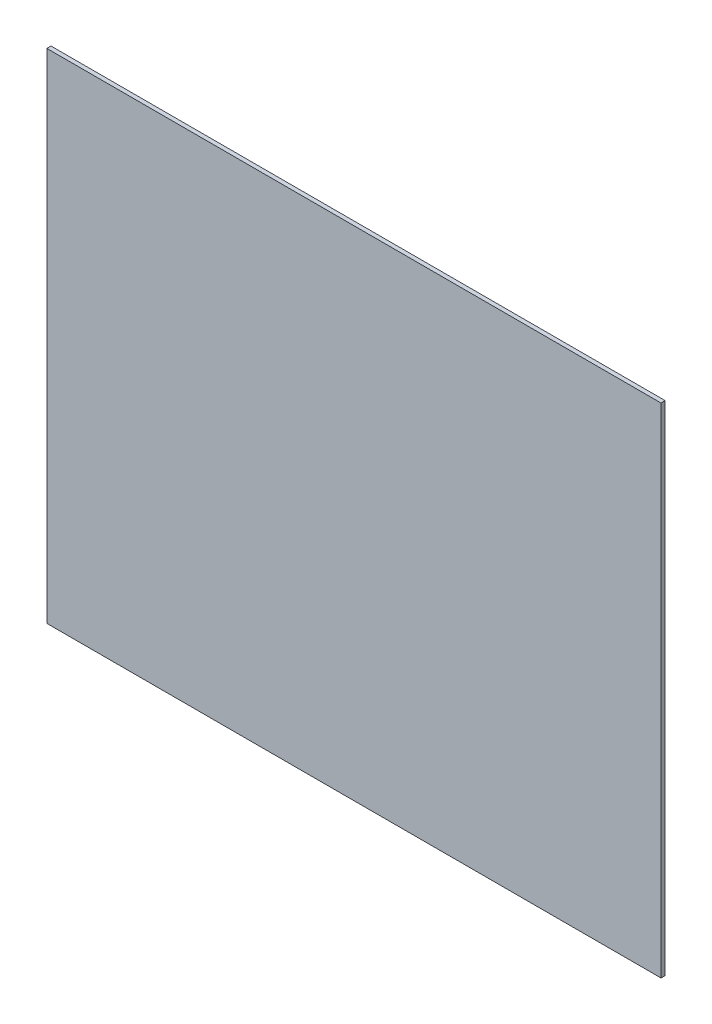
ISO-10303-21;
HEADER;
FILE_DESCRIPTION(('STEP AP214'),'2;1');
FILE_NAME('part.step','',(''),(''),'','','');
FILE_SCHEMA(('AUTOMOTIVE_DESIGN { 1 0 10303 214 1 1 1 1 }'));
ENDSEC;
DATA;
#1=APPLICATION_CONTEXT('core data for automotive mechanical design processes');
#2=APPLICATION_PROTOCOL_DEFINITION('international standard','automotive_design',2000,#1);
#3=PRODUCT_CONTEXT('',#1,'mechanical');
#4=PRODUCT('Part','Part','',(#3));
#5=PRODUCT_RELATED_PRODUCT_CATEGORY('part','',(#4));
#6=PRODUCT_DEFINITION_FORMATION('','',#4);
#7=PRODUCT_DEFINITION_CONTEXT('part definition',#1,'design');
#8=PRODUCT_DEFINITION('design','',#6,#7);
#9=PRODUCT_DEFINITION_SHAPE('','',#8);
#10=(LENGTH_UNIT() NAMED_UNIT(*) SI_UNIT(.MILLI.,.METRE.));
#11=(NAMED_UNIT(*) PLANE_ANGLE_UNIT() SI_UNIT($,.RADIAN.));
#12=(NAMED_UNIT(*) SI_UNIT($,.STERADIAN.) SOLID_ANGLE_UNIT());
#13=UNCERTAINTY_MEASURE_WITH_UNIT(LENGTH_MEASURE(1.E-05),#10,'distance_accuracy_value','');
#14=(GEOMETRIC_REPRESENTATION_CONTEXT(3) GLOBAL_UNCERTAINTY_ASSIGNED_CONTEXT((#13)) GLOBAL_UNIT_ASSIGNED_CONTEXT((#10,
#11,#12)) REPRESENTATION_CONTEXT('',''));
#15=CARTESIAN_POINT('',(0.,0.,0.));
#16=DIRECTION('',(0.,0.,1.));
#17=DIRECTION('',(1.,0.,0.));
#18=AXIS2_PLACEMENT_3D('',#15,#16,#17);
#19=CARTESIAN_POINT('',(234.95,-190.5,3.175));
#20=DIRECTION('',(-1.,0.,0.));
#21=DIRECTION('',(0.,0.,1.));
#22=AXIS2_PLACEMENT_3D('',#19,#20,#21);
#23=PLANE('',#22);
#24=DIRECTION('',(0.,1.,0.));
#25=VECTOR('',#24,1.);
#26=CARTESIAN_POINT('',(234.95,-190.5,0.));
#27=LINE('',#26,#25);
#28=CARTESIAN_POINT('',(234.95,-190.5,0.));
#29=VERTEX_POINT('',#28);
#30=CARTESIAN_POINT('',(234.95,190.5,0.));
#31=VERTEX_POINT('',#30);
#32=EDGE_CURVE('E97',#29,#31,#27,.T.);
#33=ORIENTED_EDGE('',*,*,#32,.T.);
#34=DIRECTION('',(0.,0.,-1.));
#35=VECTOR('',#34,1.);
#36=CARTESIAN_POINT('',(234.95,190.5,3.175));
#37=LINE('',#36,#35);
#38=CARTESIAN_POINT('',(234.95,190.5,3.175));
#39=VERTEX_POINT('',#38);
#40=EDGE_CURVE('E11',#39,#31,#37,.T.);
#41=ORIENTED_EDGE('',*,*,#40,.F.);
#42=DIRECTION('',(0.,1.,0.));
#43=VECTOR('',#42,1.);
#44=CARTESIAN_POINT('',(234.95,-190.5,3.175));
#45=LINE('',#44,#43);
#46=CARTESIAN_POINT('',(234.95,-190.5,3.175));
#47=VERTEX_POINT('',#46);
#48=EDGE_CURVE('E85',#47,#39,#45,.T.);
#49=ORIENTED_EDGE('',*,*,#48,.F.);
#50=DIRECTION('',(0.,0.,-1.));
#51=VECTOR('',#50,1.);
#52=CARTESIAN_POINT('',(234.95,-190.5,3.175));
#53=LINE('',#52,#51);
#54=EDGE_CURVE('E93',#47,#29,#53,.T.);
#55=ORIENTED_EDGE('',*,*,#54,.T.);
#56=EDGE_LOOP('',(#33,#41,#49,#55));
#57=FACE_BOUND('',#56,.T.);
#58=ADVANCED_FACE('F34',(#57),#23,.F.);
#59=CARTESIAN_POINT('',(-234.95,190.5,3.175));
#60=DIRECTION('',(0.,-1.,0.));
#61=DIRECTION('',(0.,0.,-1.));
#62=AXIS2_PLACEMENT_3D('',#59,#60,#61);
#63=PLANE('',#62);
#64=DIRECTION('',(-1.,0.,0.));
#65=VECTOR('',#64,1.);
#66=CARTESIAN_POINT('',(-234.95,190.5,0.));
#67=LINE('',#66,#65);
#68=CARTESIAN_POINT('',(-234.95,190.5,0.));
#69=VERTEX_POINT('',#68);
#70=EDGE_CURVE('E89',#31,#69,#67,.T.);
#71=ORIENTED_EDGE('',*,*,#70,.T.);
#72=DIRECTION('',(0.,0.,-1.));
#73=VECTOR('',#72,1.);
#74=CARTESIAN_POINT('',(-234.95,190.5,3.175));
#75=LINE('',#74,#73);
#76=CARTESIAN_POINT('',(-234.95,190.5,3.175));
#77=VERTEX_POINT('',#76);
#78=EDGE_CURVE('E42',#77,#69,#75,.T.);
#79=ORIENTED_EDGE('',*,*,#78,.F.);
#80=DIRECTION('',(-1.,0.,0.));
#81=VECTOR('',#80,1.);
#82=CARTESIAN_POINT('',(-234.95,190.5,3.175));
#83=LINE('',#82,#81);
#84=EDGE_CURVE('E80',#39,#77,#83,.T.);
#85=ORIENTED_EDGE('',*,*,#84,.F.);
#86=ORIENTED_EDGE('',*,*,#40,.T.);
#87=EDGE_LOOP('',(#71,#79,#85,#86));
#88=FACE_BOUND('',#87,.T.);
#89=ADVANCED_FACE('F88',(#88),#63,.F.);
#90=CARTESIAN_POINT('',(-234.95,-190.5,3.175));
#91=DIRECTION('',(1.,0.,0.));
#92=DIRECTION('',(0.,0.,-1.));
#93=AXIS2_PLACEMENT_3D('',#90,#91,#92);
#94=PLANE('',#93);
#95=DIRECTION('',(0.,-1.,0.));
#96=VECTOR('',#95,1.);
#97=CARTESIAN_POINT('',(-234.95,-190.5,0.));
#98=LINE('',#97,#96);
#99=CARTESIAN_POINT('',(-234.95,-190.5,0.));
#100=VERTEX_POINT('',#99);
#101=EDGE_CURVE('E67',#69,#100,#98,.T.);
#102=ORIENTED_EDGE('',*,*,#101,.T.);
#103=DIRECTION('',(0.,0.,-1.));
#104=VECTOR('',#103,1.);
#105=CARTESIAN_POINT('',(-234.95,-190.5,3.175));
#106=LINE('',#105,#104);
#107=CARTESIAN_POINT('',(-234.95,-190.5,3.175));
#108=VERTEX_POINT('',#107);
#109=EDGE_CURVE('E90',#108,#100,#106,.T.);
#110=ORIENTED_EDGE('',*,*,#109,.F.);
#111=DIRECTION('',(0.,-1.,0.));
#112=VECTOR('',#111,1.);
#113=CARTESIAN_POINT('',(-234.95,-190.5,3.175));
#114=LINE('',#113,#112);
#115=EDGE_CURVE('E83',#77,#108,#114,.T.);
#116=ORIENTED_EDGE('',*,*,#115,.F.);
#117=ORIENTED_EDGE('',*,*,#78,.T.);
#118=EDGE_LOOP('',(#102,#110,#116,#117));
#119=FACE_BOUND('',#118,.T.);
#120=ADVANCED_FACE('F91',(#119),#94,.F.);
#121=CARTESIAN_POINT('',(-234.95,-190.5,3.175));
#122=DIRECTION('',(0.,1.,0.));
#123=DIRECTION('',(0.,0.,1.));
#124=AXIS2_PLACEMENT_3D('',#121,#122,#123);
#125=PLANE('',#124);
#126=DIRECTION('',(1.,0.,0.));
#127=VECTOR('',#126,1.);
#128=CARTESIAN_POINT('',(-234.95,-190.5,0.));
#129=LINE('',#128,#127);
#130=EDGE_CURVE('E73',#100,#29,#129,.T.);
#131=ORIENTED_EDGE('',*,*,#130,.T.);
#132=ORIENTED_EDGE('',*,*,#54,.F.);
#133=DIRECTION('',(1.,0.,0.));
#134=VECTOR('',#133,1.);
#135=CARTESIAN_POINT('',(-234.95,-190.5,3.175));
#136=LINE('',#135,#134);
#137=EDGE_CURVE('E50',#108,#47,#136,.T.);
#138=ORIENTED_EDGE('',*,*,#137,.F.);
#139=ORIENTED_EDGE('',*,*,#109,.T.);
#140=EDGE_LOOP('',(#131,#132,#138,#139));
#141=FACE_BOUND('',#140,.T.);
#142=ADVANCED_FACE('F104',(#141),#125,.F.);
#143=CARTESIAN_POINT('',(0.,0.,3.175));
#144=DIRECTION('',(0.,0.,-1.));
#145=DIRECTION('',(-1.,0.,0.));
#146=AXIS2_PLACEMENT_3D('',#143,#144,#145);
#147=PLANE('',#146);
#148=ORIENTED_EDGE('',*,*,#48,.T.);
#149=ORIENTED_EDGE('',*,*,#84,.T.);
#150=ORIENTED_EDGE('',*,*,#115,.T.);
#151=ORIENTED_EDGE('',*,*,#137,.T.);
#152=EDGE_LOOP('',(#148,#149,#150,#151));
#153=FACE_BOUND('',#152,.T.);
#154=ADVANCED_FACE('F81',(#153),#147,.F.);
#155=CARTESIAN_POINT('',(0.,0.,0.));
#156=DIRECTION('',(0.,0.,-1.));
#157=DIRECTION('',(-1.,0.,0.));
#158=AXIS2_PLACEMENT_3D('',#155,#156,#157);
#159=PLANE('',#158);
#160=ORIENTED_EDGE('',*,*,#32,.F.);
#161=ORIENTED_EDGE('',*,*,#130,.F.);
#162=ORIENTED_EDGE('',*,*,#101,.F.);
#163=ORIENTED_EDGE('',*,*,#70,.F.);
#164=EDGE_LOOP('',(#160,#161,#162,#163));
#165=FACE_BOUND('',#164,.T.);
#166=ADVANCED_FACE('F107',(#165),#159,.T.);
#167=CLOSED_SHELL('',(#58,#89,#120,#142,#154,#166));
#168=MANIFOLD_SOLID_BREP('B2',#167);
#169=ADVANCED_BREP_SHAPE_REPRESENTATION('',(#18,#168),#14);
#170=SHAPE_DEFINITION_REPRESENTATION(#9,#169);
ENDSEC;
END-ISO-10303-21;
